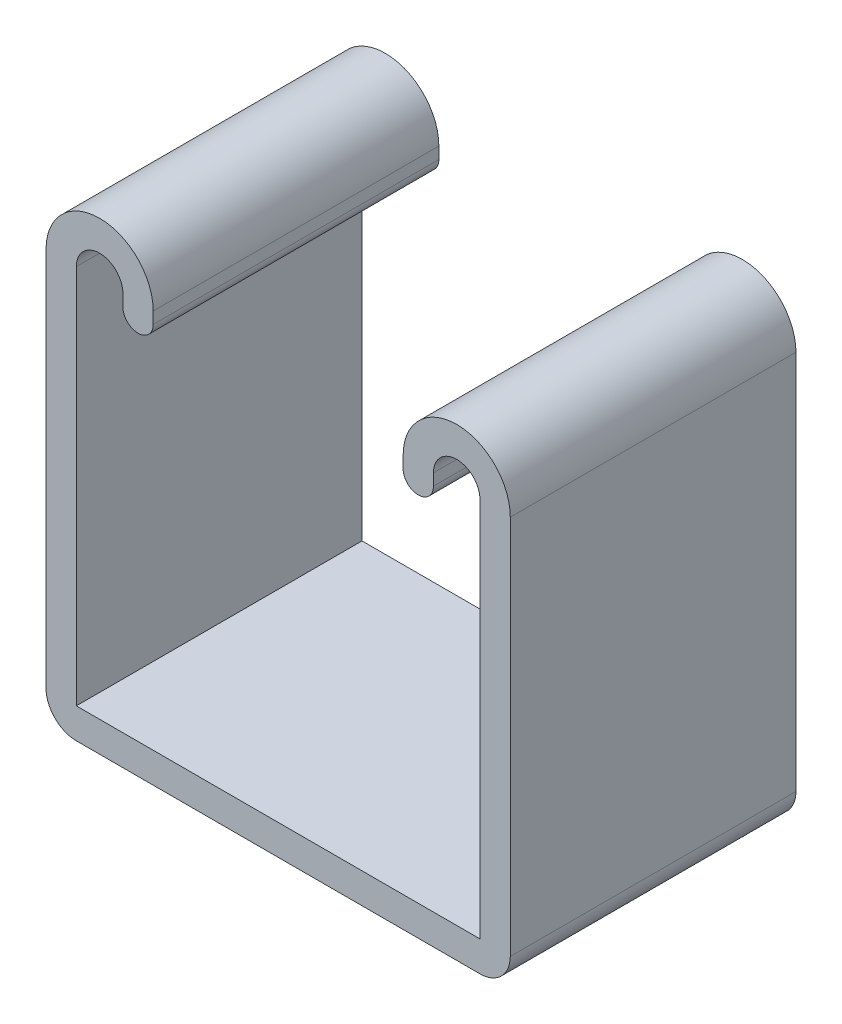
ISO-10303-21;
HEADER;
FILE_DESCRIPTION(('STEP AP214'),'2;1');
FILE_NAME('part.step','',(''),(''),'','','');
FILE_SCHEMA(('AUTOMOTIVE_DESIGN { 1 0 10303 214 1 1 1 1 }'));
ENDSEC;
DATA;
#1=APPLICATION_CONTEXT('core data for automotive mechanical design processes');
#2=APPLICATION_PROTOCOL_DEFINITION('international standard','automotive_design',2000,#1);
#3=PRODUCT_CONTEXT('',#1,'mechanical');
#4=PRODUCT('Part','Part','',(#3));
#5=PRODUCT_RELATED_PRODUCT_CATEGORY('part','',(#4));
#6=PRODUCT_DEFINITION_FORMATION('','',#4);
#7=PRODUCT_DEFINITION_CONTEXT('part definition',#1,'design');
#8=PRODUCT_DEFINITION('design','',#6,#7);
#9=PRODUCT_DEFINITION_SHAPE('','',#8);
#10=(LENGTH_UNIT() NAMED_UNIT(*) SI_UNIT(.MILLI.,.METRE.));
#11=(NAMED_UNIT(*) PLANE_ANGLE_UNIT() SI_UNIT($,.RADIAN.));
#12=(NAMED_UNIT(*) SI_UNIT($,.STERADIAN.) SOLID_ANGLE_UNIT());
#13=UNCERTAINTY_MEASURE_WITH_UNIT(LENGTH_MEASURE(1.E-05),#10,'distance_accuracy_value','');
#14=(GEOMETRIC_REPRESENTATION_CONTEXT(3) GLOBAL_UNCERTAINTY_ASSIGNED_CONTEXT((#13)) GLOBAL_UNIT_ASSIGNED_CONTEXT((#10,
#11,#12)) REPRESENTATION_CONTEXT('',''));
#15=CARTESIAN_POINT('',(0.,0.,0.));
#16=DIRECTION('',(0.,0.,1.));
#17=DIRECTION('',(1.,0.,0.));
#18=AXIS2_PLACEMENT_3D('',#15,#16,#17);
#19=CARTESIAN_POINT('',(-15.875,18.4785,12.7));
#20=DIRECTION('',(0.,0.,-1.));
#21=DIRECTION('',(-1.,0.,0.));
#22=AXIS2_PLACEMENT_3D('',#19,#20,#21);
#23=CYLINDRICAL_SURFACE('',#22,4.7625);
#24=CARTESIAN_POINT('',(-15.875,18.4785,-12.7));
#25=DIRECTION('',(0.,0.,1.));
#26=DIRECTION('',(-1.,0.,0.));
#27=AXIS2_PLACEMENT_3D('',#24,#25,#26);
#28=CIRCLE('',#27,4.7625);
#29=CARTESIAN_POINT('',(-11.1125,18.4785,-12.7));
#30=VERTEX_POINT('',#29);
#31=CARTESIAN_POINT('',(-20.6375,18.4785,-12.7));
#32=VERTEX_POINT('',#31);
#33=EDGE_CURVE('E188',#30,#32,#28,.T.);
#34=ORIENTED_EDGE('',*,*,#33,.T.);
#35=DIRECTION('',(0.,0.,-1.));
#36=VECTOR('',#35,1.);
#37=CARTESIAN_POINT('',(-20.6375,18.4785,12.7));
#38=LINE('',#37,#36);
#39=CARTESIAN_POINT('',(-20.6375,18.4785,12.7));
#40=VERTEX_POINT('',#39);
#41=EDGE_CURVE('E11',#40,#32,#38,.T.);
#42=ORIENTED_EDGE('',*,*,#41,.F.);
#43=CARTESIAN_POINT('',(-15.875,18.4785,12.7));
#44=DIRECTION('',(0.,0.,1.));
#45=DIRECTION('',(-1.,0.,0.));
#46=AXIS2_PLACEMENT_3D('',#43,#44,#45);
#47=CIRCLE('',#46,4.7625);
#48=CARTESIAN_POINT('',(-11.1125,18.4785,12.7));
#49=VERTEX_POINT('',#48);
#50=EDGE_CURVE('E222',#49,#40,#47,.T.);
#51=ORIENTED_EDGE('',*,*,#50,.F.);
#52=DIRECTION('',(0.,0.,-1.));
#53=VECTOR('',#52,1.);
#54=CARTESIAN_POINT('',(-11.1125,18.4785,12.7));
#55=LINE('',#54,#53);
#56=EDGE_CURVE('E184',#49,#30,#55,.T.);
#57=ORIENTED_EDGE('',*,*,#56,.T.);
#58=EDGE_LOOP('',(#34,#42,#51,#57));
#59=FACE_BOUND('',#58,.T.);
#60=ADVANCED_FACE('F32',(#59),#23,.T.);
#61=CARTESIAN_POINT('',(-20.6375,18.4785,12.7));
#62=DIRECTION('',(1.,0.,0.));
#63=DIRECTION('',(0.,1.,0.));
#64=AXIS2_PLACEMENT_3D('',#61,#62,#63);
#65=PLANE('',#64);
#66=DIRECTION('',(0.,-1.,0.));
#67=VECTOR('',#66,1.);
#68=CARTESIAN_POINT('',(-20.6375,18.4785,-12.7));
#69=LINE('',#68,#67);
#70=CARTESIAN_POINT('',(-20.6375,-15.3416,-12.7));
#71=VERTEX_POINT('',#70);
#72=EDGE_CURVE('E191',#32,#71,#69,.T.);
#73=ORIENTED_EDGE('',*,*,#72,.T.);
#74=DIRECTION('',(0.,0.,-1.));
#75=VECTOR('',#74,1.);
#76=CARTESIAN_POINT('',(-20.6375,-15.3416,12.7));
#77=LINE('',#76,#75);
#78=CARTESIAN_POINT('',(-20.6375,-15.3416,12.7));
#79=VERTEX_POINT('',#78);
#80=EDGE_CURVE('E40',#79,#71,#77,.T.);
#81=ORIENTED_EDGE('',*,*,#80,.F.);
#82=DIRECTION('',(0.,-1.,0.));
#83=VECTOR('',#82,1.);
#84=CARTESIAN_POINT('',(-20.6375,18.4785,12.7));
#85=LINE('',#84,#83);
#86=EDGE_CURVE('E121',#40,#79,#85,.T.);
#87=ORIENTED_EDGE('',*,*,#86,.F.);
#88=ORIENTED_EDGE('',*,*,#41,.T.);
#89=EDGE_LOOP('',(#73,#81,#87,#88));
#90=FACE_BOUND('',#89,.T.);
#91=ADVANCED_FACE('F330',(#90),#65,.F.);
#92=CARTESIAN_POINT('',(-17.9451,-15.3416,12.7));
#93=DIRECTION('',(0.,0.,-1.));
#94=DIRECTION('',(-1.,0.,0.));
#95=AXIS2_PLACEMENT_3D('',#92,#93,#94);
#96=CYLINDRICAL_SURFACE('',#95,2.6924);
#97=CARTESIAN_POINT('',(-17.9451,-15.3416,-12.7));
#98=DIRECTION('',(0.,0.,1.));
#99=DIRECTION('',(-1.,0.,0.));
#100=AXIS2_PLACEMENT_3D('',#97,#98,#99);
#101=CIRCLE('',#100,2.6924);
#102=CARTESIAN_POINT('',(-17.9451,-18.034,-12.7));
#103=VERTEX_POINT('',#102);
#104=EDGE_CURVE('E193',#71,#103,#101,.T.);
#105=ORIENTED_EDGE('',*,*,#104,.T.);
#106=DIRECTION('',(0.,0.,-1.));
#107=VECTOR('',#106,1.);
#108=CARTESIAN_POINT('',(-17.9451,-18.034,12.7));
#109=LINE('',#108,#107);
#110=CARTESIAN_POINT('',(-17.9451,-18.034,12.7));
#111=VERTEX_POINT('',#110);
#112=EDGE_CURVE('E259',#111,#103,#109,.T.);
#113=ORIENTED_EDGE('',*,*,#112,.F.);
#114=CARTESIAN_POINT('',(-17.9451,-15.3416,12.7));
#115=DIRECTION('',(0.,0.,1.));
#116=DIRECTION('',(-1.,0.,0.));
#117=AXIS2_PLACEMENT_3D('',#114,#115,#116);
#118=CIRCLE('',#117,2.6924);
#119=EDGE_CURVE('E267',#79,#111,#118,.T.);
#120=ORIENTED_EDGE('',*,*,#119,.F.);
#121=ORIENTED_EDGE('',*,*,#80,.T.);
#122=EDGE_LOOP('',(#105,#113,#120,#121));
#123=FACE_BOUND('',#122,.T.);
#124=ADVANCED_FACE('F265',(#123),#96,.T.);
#125=CARTESIAN_POINT('',(-17.9451,-18.034,12.7));
#126=DIRECTION('',(0.,1.,0.));
#127=DIRECTION('',(-1.,0.,0.));
#128=AXIS2_PLACEMENT_3D('',#125,#126,#127);
#129=PLANE('',#128);
#130=DIRECTION('',(1.,0.,0.));
#131=VECTOR('',#130,1.);
#132=CARTESIAN_POINT('',(-17.9451,-18.034,-12.7));
#133=LINE('',#132,#131);
#134=CARTESIAN_POINT('',(17.9451,-18.034,-12.7));
#135=VERTEX_POINT('',#134);
#136=EDGE_CURVE('E195',#103,#135,#133,.T.);
#137=ORIENTED_EDGE('',*,*,#136,.T.);
#138=DIRECTION('',(0.,0.,-1.));
#139=VECTOR('',#138,1.);
#140=CARTESIAN_POINT('',(17.9451,-18.034,12.7));
#141=LINE('',#140,#139);
#142=CARTESIAN_POINT('',(17.9451,-18.034,12.7));
#143=VERTEX_POINT('',#142);
#144=EDGE_CURVE('E256',#143,#135,#141,.T.);
#145=ORIENTED_EDGE('',*,*,#144,.F.);
#146=DIRECTION('',(1.,0.,0.));
#147=VECTOR('',#146,1.);
#148=CARTESIAN_POINT('',(-17.9451,-18.034,12.7));
#149=LINE('',#148,#147);
#150=EDGE_CURVE('E285',#111,#143,#149,.T.);
#151=ORIENTED_EDGE('',*,*,#150,.F.);
#152=ORIENTED_EDGE('',*,*,#112,.T.);
#153=EDGE_LOOP('',(#137,#145,#151,#152));
#154=FACE_BOUND('',#153,.T.);
#155=ADVANCED_FACE('F276',(#154),#129,.F.);
#156=CARTESIAN_POINT('',(17.9451,-15.3416,12.7));
#157=DIRECTION('',(0.,0.,-1.));
#158=DIRECTION('',(-1.,0.,0.));
#159=AXIS2_PLACEMENT_3D('',#156,#157,#158);
#160=CYLINDRICAL_SURFACE('',#159,2.6924);
#161=CARTESIAN_POINT('',(17.9451,-15.3416,-12.7));
#162=DIRECTION('',(0.,0.,1.));
#163=DIRECTION('',(1.,0.,0.));
#164=AXIS2_PLACEMENT_3D('',#161,#162,#163);
#165=CIRCLE('',#164,2.6924);
#166=CARTESIAN_POINT('',(20.6375,-15.3416,-12.7));
#167=VERTEX_POINT('',#166);
#168=EDGE_CURVE('E197',#135,#167,#165,.T.);
#169=ORIENTED_EDGE('',*,*,#168,.T.);
#170=DIRECTION('',(0.,0.,-1.));
#171=VECTOR('',#170,1.);
#172=CARTESIAN_POINT('',(20.6375,-15.3416,12.7));
#173=LINE('',#172,#171);
#174=CARTESIAN_POINT('',(20.6375,-15.3416,12.7));
#175=VERTEX_POINT('',#174);
#176=EDGE_CURVE('E253',#175,#167,#173,.T.);
#177=ORIENTED_EDGE('',*,*,#176,.F.);
#178=CARTESIAN_POINT('',(17.9451,-15.3416,12.7));
#179=DIRECTION('',(0.,0.,1.));
#180=DIRECTION('',(1.,0.,0.));
#181=AXIS2_PLACEMENT_3D('',#178,#179,#180);
#182=CIRCLE('',#181,2.6924);
#183=EDGE_CURVE('E282',#143,#175,#182,.T.);
#184=ORIENTED_EDGE('',*,*,#183,.F.);
#185=ORIENTED_EDGE('',*,*,#144,.T.);
#186=EDGE_LOOP('',(#169,#177,#184,#185));
#187=FACE_BOUND('',#186,.T.);
#188=ADVANCED_FACE('F280',(#187),#160,.T.);
#189=CARTESIAN_POINT('',(20.6375,-15.3416,12.7));
#190=DIRECTION('',(-1.,0.,0.));
#191=DIRECTION('',(0.,0.,1.));
#192=AXIS2_PLACEMENT_3D('',#189,#190,#191);
#193=PLANE('',#192);
#194=DIRECTION('',(0.,1.,0.));
#195=VECTOR('',#194,1.);
#196=CARTESIAN_POINT('',(20.6375,-15.3416,-12.7));
#197=LINE('',#196,#195);
#198=CARTESIAN_POINT('',(20.6375,18.4785,-12.7));
#199=VERTEX_POINT('',#198);
#200=EDGE_CURVE('E199',#167,#199,#197,.T.);
#201=ORIENTED_EDGE('',*,*,#200,.T.);
#202=DIRECTION('',(0.,0.,-1.));
#203=VECTOR('',#202,1.);
#204=CARTESIAN_POINT('',(20.6375,18.4785,12.7));
#205=LINE('',#204,#203);
#206=CARTESIAN_POINT('',(20.6375,18.4785,12.7));
#207=VERTEX_POINT('',#206);
#208=EDGE_CURVE('E250',#207,#199,#205,.T.);
#209=ORIENTED_EDGE('',*,*,#208,.F.);
#210=DIRECTION('',(0.,1.,0.));
#211=VECTOR('',#210,1.);
#212=CARTESIAN_POINT('',(20.6375,-15.3416,12.7));
#213=LINE('',#212,#211);
#214=EDGE_CURVE('E284',#175,#207,#213,.T.);
#215=ORIENTED_EDGE('',*,*,#214,.F.);
#216=ORIENTED_EDGE('',*,*,#176,.T.);
#217=EDGE_LOOP('',(#201,#209,#215,#216));
#218=FACE_BOUND('',#217,.T.);
#219=ADVANCED_FACE('F343',(#218),#193,.F.);
#220=CARTESIAN_POINT('',(15.875,18.4785,12.7));
#221=DIRECTION('',(0.,0.,-1.));
#222=DIRECTION('',(-1.,0.,0.));
#223=AXIS2_PLACEMENT_3D('',#220,#221,#222);
#224=CYLINDRICAL_SURFACE('',#223,4.7625);
#225=CARTESIAN_POINT('',(15.875,18.4785,-12.7));
#226=DIRECTION('',(0.,0.,1.));
#227=DIRECTION('',(1.,0.,0.));
#228=AXIS2_PLACEMENT_3D('',#225,#226,#227);
#229=CIRCLE('',#228,4.7625);
#230=CARTESIAN_POINT('',(11.1125,18.4785,-12.7));
#231=VERTEX_POINT('',#230);
#232=EDGE_CURVE('E201',#199,#231,#229,.T.);
#233=ORIENTED_EDGE('',*,*,#232,.T.);
#234=DIRECTION('',(0.,0.,-1.));
#235=VECTOR('',#234,1.);
#236=CARTESIAN_POINT('',(11.1125,18.4785,12.7));
#237=LINE('',#236,#235);
#238=CARTESIAN_POINT('',(11.1125,18.4785,12.7));
#239=VERTEX_POINT('',#238);
#240=EDGE_CURVE('E247',#239,#231,#237,.T.);
#241=ORIENTED_EDGE('',*,*,#240,.F.);
#242=CARTESIAN_POINT('',(15.875,18.4785,12.7));
#243=DIRECTION('',(0.,0.,1.));
#244=DIRECTION('',(1.,0.,0.));
#245=AXIS2_PLACEMENT_3D('',#242,#243,#244);
#246=CIRCLE('',#245,4.7625);
#247=EDGE_CURVE('E287',#207,#239,#246,.T.);
#248=ORIENTED_EDGE('',*,*,#247,.F.);
#249=ORIENTED_EDGE('',*,*,#208,.T.);
#250=EDGE_LOOP('',(#233,#241,#248,#249));
#251=FACE_BOUND('',#250,.T.);
#252=ADVANCED_FACE('F346',(#251),#224,.T.);
#253=CARTESIAN_POINT('',(11.1125,18.4785,12.7));
#254=DIRECTION('',(1.,0.,0.));
#255=DIRECTION('',(0.,1.,0.));
#256=AXIS2_PLACEMENT_3D('',#253,#254,#255);
#257=PLANE('',#256);
#258=DIRECTION('',(0.,-1.,0.));
#259=VECTOR('',#258,1.);
#260=CARTESIAN_POINT('',(11.1125,18.4785,-12.7));
#261=LINE('',#260,#259);
#262=CARTESIAN_POINT('',(11.1125,17.44345,-12.7));
#263=VERTEX_POINT('',#262);
#264=EDGE_CURVE('E203',#231,#263,#261,.T.);
#265=ORIENTED_EDGE('',*,*,#264,.T.);
#266=DIRECTION('',(0.,0.,-1.));
#267=VECTOR('',#266,1.);
#268=CARTESIAN_POINT('',(11.1125,17.44345,12.7));
#269=LINE('',#268,#267);
#270=CARTESIAN_POINT('',(11.1125,17.44345,12.7));
#271=VERTEX_POINT('',#270);
#272=EDGE_CURVE('E244',#271,#263,#269,.T.);
#273=ORIENTED_EDGE('',*,*,#272,.F.);
#274=DIRECTION('',(0.,-1.,0.));
#275=VECTOR('',#274,1.);
#276=CARTESIAN_POINT('',(11.1125,18.4785,12.7));
#277=LINE('',#276,#275);
#278=EDGE_CURVE('E293',#239,#271,#277,.T.);
#279=ORIENTED_EDGE('',*,*,#278,.F.);
#280=ORIENTED_EDGE('',*,*,#240,.T.);
#281=EDGE_LOOP('',(#265,#273,#279,#280));
#282=FACE_BOUND('',#281,.T.);
#283=ADVANCED_FACE('F350',(#282),#257,.F.);
#284=CARTESIAN_POINT('',(12.4587,17.44345,12.7));
#285=DIRECTION('',(0.,0.,-1.));
#286=DIRECTION('',(-1.,0.,0.));
#287=AXIS2_PLACEMENT_3D('',#284,#285,#286);
#288=CYLINDRICAL_SURFACE('',#287,1.3462);
#289=CARTESIAN_POINT('',(12.4587,17.44345,-12.7));
#290=DIRECTION('',(0.,0.,1.));
#291=DIRECTION('',(1.,0.,0.));
#292=AXIS2_PLACEMENT_3D('',#289,#290,#291);
#293=CIRCLE('',#292,1.3462);
#294=CARTESIAN_POINT('',(13.8049,17.44345,-12.7));
#295=VERTEX_POINT('',#294);
#296=EDGE_CURVE('E205',#263,#295,#293,.T.);
#297=ORIENTED_EDGE('',*,*,#296,.T.);
#298=DIRECTION('',(0.,0.,-1.));
#299=VECTOR('',#298,1.);
#300=CARTESIAN_POINT('',(13.8049,17.44345,12.7));
#301=LINE('',#300,#299);
#302=CARTESIAN_POINT('',(13.8049,17.44345,12.7));
#303=VERTEX_POINT('',#302);
#304=EDGE_CURVE('E241',#303,#295,#301,.T.);
#305=ORIENTED_EDGE('',*,*,#304,.F.);
#306=CARTESIAN_POINT('',(12.4587,17.44345,12.7));
#307=DIRECTION('',(0.,0.,1.));
#308=DIRECTION('',(1.,0.,0.));
#309=AXIS2_PLACEMENT_3D('',#306,#307,#308);
#310=CIRCLE('',#309,1.3462);
#311=EDGE_CURVE('E295',#271,#303,#310,.T.);
#312=ORIENTED_EDGE('',*,*,#311,.F.);
#313=ORIENTED_EDGE('',*,*,#272,.T.);
#314=EDGE_LOOP('',(#297,#305,#312,#313));
#315=FACE_BOUND('',#314,.T.);
#316=ADVANCED_FACE('F354',(#315),#288,.T.);
#317=CARTESIAN_POINT('',(13.8049,18.4785,12.7));
#318=DIRECTION('',(-1.,0.,0.));
#319=DIRECTION('',(0.,0.,1.));
#320=AXIS2_PLACEMENT_3D('',#317,#318,#319);
#321=PLANE('',#320);
#322=DIRECTION('',(0.,1.,0.));
#323=VECTOR('',#322,1.);
#324=CARTESIAN_POINT('',(13.8049,18.4785,-12.7));
#325=LINE('',#324,#323);
#326=CARTESIAN_POINT('',(13.8049,18.4785,-12.7));
#327=VERTEX_POINT('',#326);
#328=EDGE_CURVE('E207',#295,#327,#325,.T.);
#329=ORIENTED_EDGE('',*,*,#328,.T.);
#330=DIRECTION('',(0.,0.,-1.));
#331=VECTOR('',#330,1.);
#332=CARTESIAN_POINT('',(13.8049,18.4785,12.7));
#333=LINE('',#332,#331);
#334=CARTESIAN_POINT('',(13.8049,18.4785,12.7));
#335=VERTEX_POINT('',#334);
#336=EDGE_CURVE('E238',#335,#327,#333,.T.);
#337=ORIENTED_EDGE('',*,*,#336,.F.);
#338=DIRECTION('',(0.,1.,0.));
#339=VECTOR('',#338,1.);
#340=CARTESIAN_POINT('',(13.8049,18.4785,12.7));
#341=LINE('',#340,#339);
#342=EDGE_CURVE('E297',#303,#335,#341,.T.);
#343=ORIENTED_EDGE('',*,*,#342,.F.);
#344=ORIENTED_EDGE('',*,*,#304,.T.);
#345=EDGE_LOOP('',(#329,#337,#343,#344));
#346=FACE_BOUND('',#345,.T.);
#347=ADVANCED_FACE('F358',(#346),#321,.F.);
#348=CARTESIAN_POINT('',(15.875,18.4785,12.7));
#349=DIRECTION('',(0.,0.,-1.));
#350=DIRECTION('',(-1.,0.,0.));
#351=AXIS2_PLACEMENT_3D('',#348,#349,#350);
#352=CYLINDRICAL_SURFACE('',#351,2.0701);
#353=CARTESIAN_POINT('',(15.875,18.4785,-12.7));
#354=DIRECTION('',(0.,0.,-1.));
#355=DIRECTION('',(1.,0.,0.));
#356=AXIS2_PLACEMENT_3D('',#353,#354,#355);
#357=CIRCLE('',#356,2.0701);
#358=CARTESIAN_POINT('',(17.9451,18.4785,-12.7));
#359=VERTEX_POINT('',#358);
#360=EDGE_CURVE('E209',#327,#359,#357,.T.);
#361=ORIENTED_EDGE('',*,*,#360,.T.);
#362=DIRECTION('',(0.,0.,-1.));
#363=VECTOR('',#362,1.);
#364=CARTESIAN_POINT('',(17.9451,18.4785,12.7));
#365=LINE('',#364,#363);
#366=CARTESIAN_POINT('',(17.9451,18.4785,12.7));
#367=VERTEX_POINT('',#366);
#368=EDGE_CURVE('E235',#367,#359,#365,.T.);
#369=ORIENTED_EDGE('',*,*,#368,.F.);
#370=CARTESIAN_POINT('',(15.875,18.4785,12.7));
#371=DIRECTION('',(0.,0.,-1.));
#372=DIRECTION('',(1.,0.,0.));
#373=AXIS2_PLACEMENT_3D('',#370,#371,#372);
#374=CIRCLE('',#373,2.0701);
#375=EDGE_CURVE('E299',#335,#367,#374,.T.);
#376=ORIENTED_EDGE('',*,*,#375,.F.);
#377=ORIENTED_EDGE('',*,*,#336,.T.);
#378=EDGE_LOOP('',(#361,#369,#376,#377));
#379=FACE_BOUND('',#378,.T.);
#380=ADVANCED_FACE('F362',(#379),#352,.F.);
#381=CARTESIAN_POINT('',(17.9451,-15.3416,12.7));
#382=DIRECTION('',(1.,0.,0.));
#383=DIRECTION('',(0.,1.,0.));
#384=AXIS2_PLACEMENT_3D('',#381,#382,#383);
#385=PLANE('',#384);
#386=DIRECTION('',(0.,-1.,0.));
#387=VECTOR('',#386,1.);
#388=CARTESIAN_POINT('',(17.9451,-15.3416,-12.7));
#389=LINE('',#388,#387);
#390=CARTESIAN_POINT('',(17.9451,-15.3416,-12.7));
#391=VERTEX_POINT('',#390);
#392=EDGE_CURVE('E211',#359,#391,#389,.T.);
#393=ORIENTED_EDGE('',*,*,#392,.T.);
#394=DIRECTION('',(0.,0.,-1.));
#395=VECTOR('',#394,1.);
#396=CARTESIAN_POINT('',(17.9451,-15.3416,12.7));
#397=LINE('',#396,#395);
#398=CARTESIAN_POINT('',(17.9451,-15.3416,12.7));
#399=VERTEX_POINT('',#398);
#400=EDGE_CURVE('E232',#399,#391,#397,.T.);
#401=ORIENTED_EDGE('',*,*,#400,.F.);
#402=DIRECTION('',(0.,-1.,0.));
#403=VECTOR('',#402,1.);
#404=CARTESIAN_POINT('',(17.9451,-15.3416,12.7));
#405=LINE('',#404,#403);
#406=EDGE_CURVE('E301',#367,#399,#405,.T.);
#407=ORIENTED_EDGE('',*,*,#406,.F.);
#408=ORIENTED_EDGE('',*,*,#368,.T.);
#409=EDGE_LOOP('',(#393,#401,#407,#408));
#410=FACE_BOUND('',#409,.T.);
#411=ADVANCED_FACE('F366',(#410),#385,.F.);
#412=CARTESIAN_POINT('',(-17.9451,-15.3416,12.7));
#413=DIRECTION('',(0.,-1.,0.));
#414=DIRECTION('',(1.,0.,0.));
#415=AXIS2_PLACEMENT_3D('',#412,#413,#414);
#416=PLANE('',#415);
#417=DIRECTION('',(-1.,0.,0.));
#418=VECTOR('',#417,1.);
#419=CARTESIAN_POINT('',(-17.9451,-15.3416,-12.7));
#420=LINE('',#419,#418);
#421=CARTESIAN_POINT('',(-17.9451,-15.3416,-12.7));
#422=VERTEX_POINT('',#421);
#423=EDGE_CURVE('E213',#391,#422,#420,.T.);
#424=ORIENTED_EDGE('',*,*,#423,.T.);
#425=DIRECTION('',(0.,0.,-1.));
#426=VECTOR('',#425,1.);
#427=CARTESIAN_POINT('',(-17.9451,-15.3416,12.7));
#428=LINE('',#427,#426);
#429=CARTESIAN_POINT('',(-17.9451,-15.3416,12.7));
#430=VERTEX_POINT('',#429);
#431=EDGE_CURVE('E229',#430,#422,#428,.T.);
#432=ORIENTED_EDGE('',*,*,#431,.F.);
#433=DIRECTION('',(-1.,0.,0.));
#434=VECTOR('',#433,1.);
#435=CARTESIAN_POINT('',(-17.9451,-15.3416,12.7));
#436=LINE('',#435,#434);
#437=EDGE_CURVE('E303',#399,#430,#436,.T.);
#438=ORIENTED_EDGE('',*,*,#437,.F.);
#439=ORIENTED_EDGE('',*,*,#400,.T.);
#440=EDGE_LOOP('',(#424,#432,#438,#439));
#441=FACE_BOUND('',#440,.T.);
#442=ADVANCED_FACE('F370',(#441),#416,.F.);
#443=CARTESIAN_POINT('',(-17.9451,18.4785,12.7));
#444=DIRECTION('',(-1.,0.,0.));
#445=DIRECTION('',(0.,-1.,0.));
#446=AXIS2_PLACEMENT_3D('',#443,#444,#445);
#447=PLANE('',#446);
#448=DIRECTION('',(0.,1.,0.));
#449=VECTOR('',#448,1.);
#450=CARTESIAN_POINT('',(-17.9451,18.4785,-12.7));
#451=LINE('',#450,#449);
#452=CARTESIAN_POINT('',(-17.9451,18.4785,-12.7));
#453=VERTEX_POINT('',#452);
#454=EDGE_CURVE('E215',#422,#453,#451,.T.);
#455=ORIENTED_EDGE('',*,*,#454,.T.);
#456=DIRECTION('',(0.,0.,-1.));
#457=VECTOR('',#456,1.);
#458=CARTESIAN_POINT('',(-17.9451,18.4785,12.7));
#459=LINE('',#458,#457);
#460=CARTESIAN_POINT('',(-17.9451,18.4785,12.7));
#461=VERTEX_POINT('',#460);
#462=EDGE_CURVE('E226',#461,#453,#459,.T.);
#463=ORIENTED_EDGE('',*,*,#462,.F.);
#464=DIRECTION('',(0.,1.,0.));
#465=VECTOR('',#464,1.);
#466=CARTESIAN_POINT('',(-17.9451,18.4785,12.7));
#467=LINE('',#466,#465);
#468=EDGE_CURVE('E305',#430,#461,#467,.T.);
#469=ORIENTED_EDGE('',*,*,#468,.F.);
#470=ORIENTED_EDGE('',*,*,#431,.T.);
#471=EDGE_LOOP('',(#455,#463,#469,#470));
#472=FACE_BOUND('',#471,.T.);
#473=ADVANCED_FACE('F311',(#472),#447,.F.);
#474=CARTESIAN_POINT('',(-15.875,18.4785,12.7));
#475=DIRECTION('',(0.,0.,-1.));
#476=DIRECTION('',(-1.,0.,0.));
#477=AXIS2_PLACEMENT_3D('',#474,#475,#476);
#478=CYLINDRICAL_SURFACE('',#477,2.0701);
#479=CARTESIAN_POINT('',(-15.875,18.4785,-12.7));
#480=DIRECTION('',(0.,0.,-1.));
#481=DIRECTION('',(-1.,0.,0.));
#482=AXIS2_PLACEMENT_3D('',#479,#480,#481);
#483=CIRCLE('',#482,2.0701);
#484=CARTESIAN_POINT('',(-13.8049,18.4785,-12.7));
#485=VERTEX_POINT('',#484);
#486=EDGE_CURVE('E217',#453,#485,#483,.T.);
#487=ORIENTED_EDGE('',*,*,#486,.T.);
#488=DIRECTION('',(0.,0.,-1.));
#489=VECTOR('',#488,1.);
#490=CARTESIAN_POINT('',(-13.8049,18.4785,12.7));
#491=LINE('',#490,#489);
#492=CARTESIAN_POINT('',(-13.8049,18.4785,12.7));
#493=VERTEX_POINT('',#492);
#494=EDGE_CURVE('E179',#493,#485,#491,.T.);
#495=ORIENTED_EDGE('',*,*,#494,.F.);
#496=CARTESIAN_POINT('',(-15.875,18.4785,12.7));
#497=DIRECTION('',(0.,0.,-1.));
#498=DIRECTION('',(-1.,0.,0.));
#499=AXIS2_PLACEMENT_3D('',#496,#497,#498);
#500=CIRCLE('',#499,2.0701);
#501=EDGE_CURVE('E170',#461,#493,#500,.T.);
#502=ORIENTED_EDGE('',*,*,#501,.F.);
#503=ORIENTED_EDGE('',*,*,#462,.T.);
#504=EDGE_LOOP('',(#487,#495,#502,#503));
#505=FACE_BOUND('',#504,.T.);
#506=ADVANCED_FACE('F315',(#505),#478,.F.);
#507=CARTESIAN_POINT('',(-13.8049,18.4785,12.7));
#508=DIRECTION('',(1.,0.,0.));
#509=DIRECTION('',(0.,1.,0.));
#510=AXIS2_PLACEMENT_3D('',#507,#508,#509);
#511=PLANE('',#510);
#512=DIRECTION('',(0.,-1.,0.));
#513=VECTOR('',#512,1.);
#514=CARTESIAN_POINT('',(-13.8049,18.4785,-12.7));
#515=LINE('',#514,#513);
#516=CARTESIAN_POINT('',(-13.8049,17.44345,-12.7));
#517=VERTEX_POINT('',#516);
#518=EDGE_CURVE('E178',#485,#517,#515,.T.);
#519=ORIENTED_EDGE('',*,*,#518,.T.);
#520=DIRECTION('',(0.,0.,-1.));
#521=VECTOR('',#520,1.);
#522=CARTESIAN_POINT('',(-13.8049,17.44345,12.7));
#523=LINE('',#522,#521);
#524=CARTESIAN_POINT('',(-13.8049,17.44345,12.7));
#525=VERTEX_POINT('',#524);
#526=EDGE_CURVE('E175',#525,#517,#523,.T.);
#527=ORIENTED_EDGE('',*,*,#526,.F.);
#528=DIRECTION('',(0.,-1.,0.));
#529=VECTOR('',#528,1.);
#530=CARTESIAN_POINT('',(-13.8049,18.4785,12.7));
#531=LINE('',#530,#529);
#532=EDGE_CURVE('E164',#493,#525,#531,.T.);
#533=ORIENTED_EDGE('',*,*,#532,.F.);
#534=ORIENTED_EDGE('',*,*,#494,.T.);
#535=EDGE_LOOP('',(#519,#527,#533,#534));
#536=FACE_BOUND('',#535,.T.);
#537=ADVANCED_FACE('F176',(#536),#511,.F.);
#538=CARTESIAN_POINT('',(-12.4587,17.44345,12.7));
#539=DIRECTION('',(0.,0.,-1.));
#540=DIRECTION('',(-1.,0.,0.));
#541=AXIS2_PLACEMENT_3D('',#538,#539,#540);
#542=CYLINDRICAL_SURFACE('',#541,1.3462);
#543=CARTESIAN_POINT('',(-12.4587,17.44345,-12.7));
#544=DIRECTION('',(0.,0.,1.));
#545=DIRECTION('',(-1.,0.,0.));
#546=AXIS2_PLACEMENT_3D('',#543,#544,#545);
#547=CIRCLE('',#546,1.3462);
#548=CARTESIAN_POINT('',(-11.1125,17.44345,-12.7));
#549=VERTEX_POINT('',#548);
#550=EDGE_CURVE('E107',#517,#549,#547,.T.);
#551=ORIENTED_EDGE('',*,*,#550,.T.);
#552=DIRECTION('',(0.,0.,-1.));
#553=VECTOR('',#552,1.);
#554=CARTESIAN_POINT('',(-11.1125,17.44345,12.7));
#555=LINE('',#554,#553);
#556=CARTESIAN_POINT('',(-11.1125,17.44345,12.7));
#557=VERTEX_POINT('',#556);
#558=EDGE_CURVE('E180',#557,#549,#555,.T.);
#559=ORIENTED_EDGE('',*,*,#558,.F.);
#560=CARTESIAN_POINT('',(-12.4587,17.44345,12.7));
#561=DIRECTION('',(0.,0.,1.));
#562=DIRECTION('',(-1.,0.,0.));
#563=AXIS2_PLACEMENT_3D('',#560,#561,#562);
#564=CIRCLE('',#563,1.3462);
#565=EDGE_CURVE('E168',#525,#557,#564,.T.);
#566=ORIENTED_EDGE('',*,*,#565,.F.);
#567=ORIENTED_EDGE('',*,*,#526,.T.);
#568=EDGE_LOOP('',(#551,#559,#566,#567));
#569=FACE_BOUND('',#568,.T.);
#570=ADVANCED_FACE('F182',(#569),#542,.T.);
#571=CARTESIAN_POINT('',(-11.1125,18.4785,12.7));
#572=DIRECTION('',(-1.,0.,0.));
#573=DIRECTION('',(0.,0.,1.));
#574=AXIS2_PLACEMENT_3D('',#571,#572,#573);
#575=PLANE('',#574);
#576=DIRECTION('',(0.,1.,0.));
#577=VECTOR('',#576,1.);
#578=CARTESIAN_POINT('',(-11.1125,18.4785,-12.7));
#579=LINE('',#578,#577);
#580=EDGE_CURVE('E113',#549,#30,#579,.T.);
#581=ORIENTED_EDGE('',*,*,#580,.T.);
#582=ORIENTED_EDGE('',*,*,#56,.F.);
#583=DIRECTION('',(0.,1.,0.));
#584=VECTOR('',#583,1.);
#585=CARTESIAN_POINT('',(-11.1125,18.4785,12.7));
#586=LINE('',#585,#584);
#587=EDGE_CURVE('E48',#557,#49,#586,.T.);
#588=ORIENTED_EDGE('',*,*,#587,.F.);
#589=ORIENTED_EDGE('',*,*,#558,.T.);
#590=EDGE_LOOP('',(#581,#582,#588,#589));
#591=FACE_BOUND('',#590,.T.);
#592=ADVANCED_FACE('F319',(#591),#575,.F.);
#593=CARTESIAN_POINT('',(-15.875,18.4785,12.7));
#594=DIRECTION('',(0.,0.,-1.));
#595=DIRECTION('',(-1.,0.,0.));
#596=AXIS2_PLACEMENT_3D('',#593,#594,#595);
#597=PLANE('',#596);
#598=ORIENTED_EDGE('',*,*,#50,.T.);
#599=ORIENTED_EDGE('',*,*,#86,.T.);
#600=ORIENTED_EDGE('',*,*,#119,.T.);
#601=ORIENTED_EDGE('',*,*,#150,.T.);
#602=ORIENTED_EDGE('',*,*,#183,.T.);
#603=ORIENTED_EDGE('',*,*,#214,.T.);
#604=ORIENTED_EDGE('',*,*,#247,.T.);
#605=ORIENTED_EDGE('',*,*,#278,.T.);
#606=ORIENTED_EDGE('',*,*,#311,.T.);
#607=ORIENTED_EDGE('',*,*,#342,.T.);
#608=ORIENTED_EDGE('',*,*,#375,.T.);
#609=ORIENTED_EDGE('',*,*,#406,.T.);
#610=ORIENTED_EDGE('',*,*,#437,.T.);
#611=ORIENTED_EDGE('',*,*,#468,.T.);
#612=ORIENTED_EDGE('',*,*,#501,.T.);
#613=ORIENTED_EDGE('',*,*,#532,.T.);
#614=ORIENTED_EDGE('',*,*,#565,.T.);
#615=ORIENTED_EDGE('',*,*,#587,.T.);
#616=EDGE_LOOP('',(#598,#599,#600,#601,#602,#603,#604,#605,#606,#607,#608,#609,#610,#611,#612,
#613,#614,#615));
#617=FACE_BOUND('',#616,.T.);
#618=ADVANCED_FACE('F166',(#617),#597,.F.);
#619=CARTESIAN_POINT('',(-15.875,18.4785,-12.7));
#620=DIRECTION('',(0.,0.,-1.));
#621=DIRECTION('',(-1.,0.,0.));
#622=AXIS2_PLACEMENT_3D('',#619,#620,#621);
#623=PLANE('',#622);
#624=ORIENTED_EDGE('',*,*,#33,.F.);
#625=ORIENTED_EDGE('',*,*,#580,.F.);
#626=ORIENTED_EDGE('',*,*,#550,.F.);
#627=ORIENTED_EDGE('',*,*,#518,.F.);
#628=ORIENTED_EDGE('',*,*,#486,.F.);
#629=ORIENTED_EDGE('',*,*,#454,.F.);
#630=ORIENTED_EDGE('',*,*,#423,.F.);
#631=ORIENTED_EDGE('',*,*,#392,.F.);
#632=ORIENTED_EDGE('',*,*,#360,.F.);
#633=ORIENTED_EDGE('',*,*,#328,.F.);
#634=ORIENTED_EDGE('',*,*,#296,.F.);
#635=ORIENTED_EDGE('',*,*,#264,.F.);
#636=ORIENTED_EDGE('',*,*,#232,.F.);
#637=ORIENTED_EDGE('',*,*,#200,.F.);
#638=ORIENTED_EDGE('',*,*,#168,.F.);
#639=ORIENTED_EDGE('',*,*,#136,.F.);
#640=ORIENTED_EDGE('',*,*,#104,.F.);
#641=ORIENTED_EDGE('',*,*,#72,.F.);
#642=EDGE_LOOP('',(#624,#625,#626,#627,#628,#629,#630,#631,#632,#633,#634,#635,#636,#637,#638,
#639,#640,#641));
#643=FACE_BOUND('',#642,.T.);
#644=ADVANCED_FACE('F271',(#643),#623,.T.);
#645=CLOSED_SHELL('',(#60,#91,#124,#155,#188,#219,#252,#283,#316,#347,#380,#411,#442,#473,#506,
#537,#570,#592,#618,#644));
#646=MANIFOLD_SOLID_BREP('B2',#645);
#647=ADVANCED_BREP_SHAPE_REPRESENTATION('',(#18,#646),#14);
#648=SHAPE_DEFINITION_REPRESENTATION(#9,#647);
ENDSEC;
END-ISO-10303-21;
